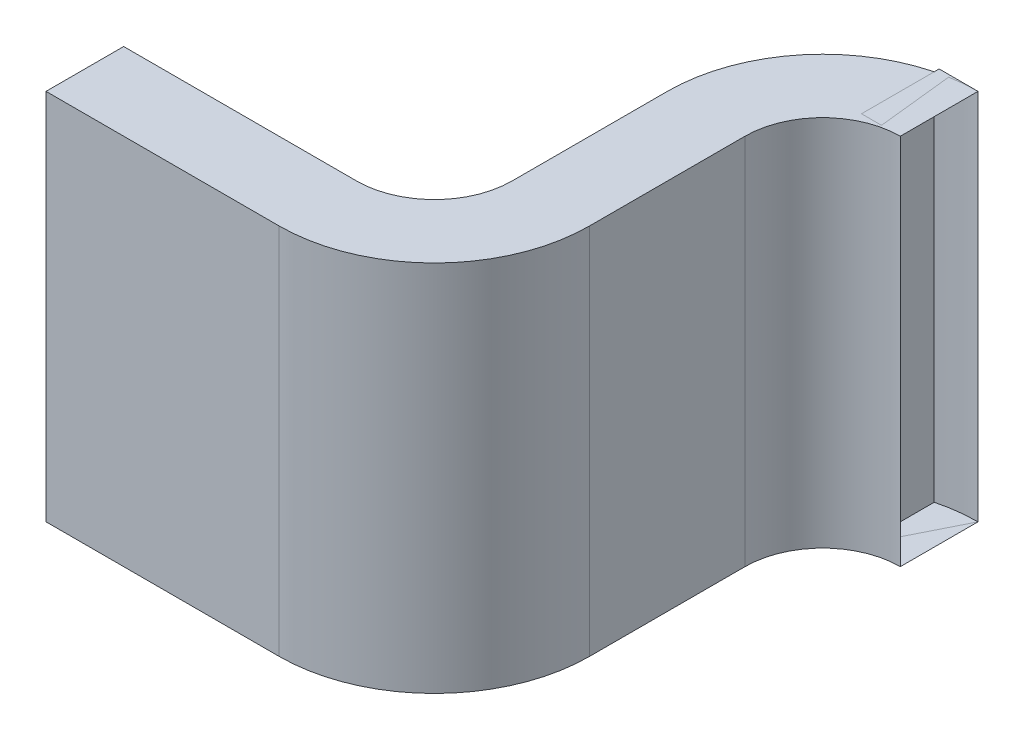
ISO-10303-21;
HEADER;
FILE_DESCRIPTION(('STEP AP214'),'2;1');
FILE_NAME('part.step','',(''),(''),'','','');
FILE_SCHEMA(('AUTOMOTIVE_DESIGN { 1 0 10303 214 1 1 1 1 }'));
ENDSEC;
DATA;
#1=APPLICATION_CONTEXT('core data for automotive mechanical design processes');
#2=APPLICATION_PROTOCOL_DEFINITION('international standard','automotive_design',2000,#1);
#3=PRODUCT_CONTEXT('',#1,'mechanical');
#4=PRODUCT('Part','Part','',(#3));
#5=PRODUCT_RELATED_PRODUCT_CATEGORY('part','',(#4));
#6=PRODUCT_DEFINITION_FORMATION('','',#4);
#7=PRODUCT_DEFINITION_CONTEXT('part definition',#1,'design');
#8=PRODUCT_DEFINITION('design','',#6,#7);
#9=PRODUCT_DEFINITION_SHAPE('','',#8);
#10=(LENGTH_UNIT() NAMED_UNIT(*) SI_UNIT(.MILLI.,.METRE.));
#11=(NAMED_UNIT(*) PLANE_ANGLE_UNIT() SI_UNIT($,.RADIAN.));
#12=(NAMED_UNIT(*) SI_UNIT($,.STERADIAN.) SOLID_ANGLE_UNIT());
#13=UNCERTAINTY_MEASURE_WITH_UNIT(LENGTH_MEASURE(1.E-05),#10,'distance_accuracy_value','');
#14=(GEOMETRIC_REPRESENTATION_CONTEXT(3) GLOBAL_UNCERTAINTY_ASSIGNED_CONTEXT((#13)) GLOBAL_UNIT_ASSIGNED_CONTEXT((#10,
#11,#12)) REPRESENTATION_CONTEXT('',''));
#15=CARTESIAN_POINT('',(0.,0.,0.));
#16=DIRECTION('',(0.,0.,1.));
#17=DIRECTION('',(1.,0.,0.));
#18=AXIS2_PLACEMENT_3D('',#15,#16,#17);
#19=CARTESIAN_POINT('',(0.,0.24,0.6));
#20=DIRECTION('',(0.,0.,-1.));
#21=DIRECTION('',(-1.,0.,0.));
#22=AXIS2_PLACEMENT_3D('',#19,#20,#21);
#23=PLANE('',#22);
#24=DIRECTION('',(1.,0.,0.));
#25=VECTOR('',#24,1.);
#26=CARTESIAN_POINT('',(0.,0.24,0.6));
#27=LINE('',#26,#25);
#28=CARTESIAN_POINT('',(0.3,0.24,0.6));
#29=VERTEX_POINT('',#28);
#30=CARTESIAN_POINT('',(0.,0.24,0.6));
#31=VERTEX_POINT('',#30);
#32=EDGE_CURVE('E191',#29,#31,#27,.F.);
#33=ORIENTED_EDGE('',*,*,#32,.T.);
#34=DIRECTION('',(0.,1.,0.));
#35=VECTOR('',#34,1.);
#36=CARTESIAN_POINT('',(0.,-0.24,0.6));
#37=LINE('',#36,#35);
#38=CARTESIAN_POINT('',(0.,-0.24,0.6));
#39=VERTEX_POINT('',#38);
#40=EDGE_CURVE('E93',#39,#31,#37,.T.);
#41=ORIENTED_EDGE('',*,*,#40,.F.);
#42=DIRECTION('',(1.,0.,0.));
#43=VECTOR('',#42,1.);
#44=CARTESIAN_POINT('',(0.,-0.24,0.6));
#45=LINE('',#44,#43);
#46=CARTESIAN_POINT('',(0.3,-0.24,0.6));
#47=VERTEX_POINT('',#46);
#48=EDGE_CURVE('E174',#39,#47,#45,.T.);
#49=ORIENTED_EDGE('',*,*,#48,.T.);
#50=DIRECTION('',(0.,1.,0.));
#51=VECTOR('',#50,1.);
#52=CARTESIAN_POINT('',(0.3,0.24,0.6));
#53=LINE('',#52,#51);
#54=EDGE_CURVE('E85',#29,#47,#53,.F.);
#55=ORIENTED_EDGE('',*,*,#54,.F.);
#56=EDGE_LOOP('',(#33,#41,#49,#55));
#57=FACE_BOUND('',#56,.T.);
#58=ADVANCED_FACE('F16',(#57),#23,.F.);
#59=CARTESIAN_POINT('',(0.,-0.24,0.5));
#60=DIRECTION('',(-1.,0.,0.));
#61=DIRECTION('',(0.,0.,1.));
#62=AXIS2_PLACEMENT_3D('',#59,#60,#61);
#63=PLANE('',#62);
#64=DIRECTION('',(0.,0.,1.));
#65=VECTOR('',#64,1.);
#66=CARTESIAN_POINT('',(0.,0.24,0.5));
#67=LINE('',#66,#65);
#68=CARTESIAN_POINT('',(0.,0.24,0.5));
#69=VERTEX_POINT('',#68);
#70=EDGE_CURVE('E181',#31,#69,#67,.F.);
#71=ORIENTED_EDGE('',*,*,#70,.T.);
#72=DIRECTION('',(0.,1.,0.));
#73=VECTOR('',#72,1.);
#74=CARTESIAN_POINT('',(0.,-0.24,0.5));
#75=LINE('',#74,#73);
#76=CARTESIAN_POINT('',(0.,-0.24,0.5));
#77=VERTEX_POINT('',#76);
#78=EDGE_CURVE('E164',#69,#77,#75,.F.);
#79=ORIENTED_EDGE('',*,*,#78,.T.);
#80=DIRECTION('',(0.,0.,1.));
#81=VECTOR('',#80,1.);
#82=CARTESIAN_POINT('',(0.,-0.24,0.6));
#83=LINE('',#82,#81);
#84=EDGE_CURVE('E176',#77,#39,#83,.T.);
#85=ORIENTED_EDGE('',*,*,#84,.T.);
#86=ORIENTED_EDGE('',*,*,#40,.T.);
#87=EDGE_LOOP('',(#71,#79,#85,#86));
#88=FACE_BOUND('',#87,.T.);
#89=ADVANCED_FACE('F232',(#88),#63,.T.);
#90=CARTESIAN_POINT('',(0.3,0.24,0.4));
#91=DIRECTION('',(0.,1.,0.));
#92=DIRECTION('',(0.,0.,1.));
#93=AXIS2_PLACEMENT_3D('',#90,#91,#92);
#94=CYLINDRICAL_SURFACE('',#93,0.2);
#95=CARTESIAN_POINT('',(0.3,0.24,0.4));
#96=DIRECTION('',(0.,1.,0.));
#97=DIRECTION('',(0.,0.,1.));
#98=AXIS2_PLACEMENT_3D('',#95,#96,#97);
#99=CIRCLE('',#98,0.2);
#100=CARTESIAN_POINT('',(0.5,0.24,0.4));
#101=VERTEX_POINT('',#100);
#102=EDGE_CURVE('E19',#29,#101,#99,.T.);
#103=ORIENTED_EDGE('',*,*,#102,.F.);
#104=ORIENTED_EDGE('',*,*,#54,.T.);
#105=CARTESIAN_POINT('',(0.3,-0.24,0.4));
#106=DIRECTION('',(0.,1.,0.));
#107=DIRECTION('',(0.,0.,1.));
#108=AXIS2_PLACEMENT_3D('',#105,#106,#107);
#109=CIRCLE('',#108,0.2);
#110=CARTESIAN_POINT('',(0.5,-0.24,0.4));
#111=VERTEX_POINT('',#110);
#112=EDGE_CURVE('E157',#111,#47,#109,.F.);
#113=ORIENTED_EDGE('',*,*,#112,.F.);
#114=DIRECTION('',(0.,1.,0.));
#115=VECTOR('',#114,1.);
#116=CARTESIAN_POINT('',(0.5,0.24,0.4));
#117=LINE('',#116,#115);
#118=EDGE_CURVE('E152',#111,#101,#117,.T.);
#119=ORIENTED_EDGE('',*,*,#118,.T.);
#120=EDGE_LOOP('',(#103,#104,#113,#119));
#121=FACE_BOUND('',#120,.T.);
#122=ADVANCED_FACE('F220',(#121),#94,.T.);
#123=CARTESIAN_POINT('',(0.6,0.24,0.1));
#124=DIRECTION('',(0.,0.,1.));
#125=DIRECTION('',(1.,0.,0.));
#126=AXIS2_PLACEMENT_3D('',#123,#124,#125);
#127=PLANE('',#126);
#128=DIRECTION('',(1.,0.,0.));
#129=VECTOR('',#128,1.);
#130=CARTESIAN_POINT('',(0.6,0.24,0.1));
#131=LINE('',#130,#129);
#132=CARTESIAN_POINT('',(0.55,0.24,0.1));
#133=VERTEX_POINT('',#132);
#134=CARTESIAN_POINT('',(0.6,0.24,0.1));
#135=VERTEX_POINT('',#134);
#136=EDGE_CURVE('E150',#133,#135,#131,.T.);
#137=ORIENTED_EDGE('',*,*,#136,.T.);
#138=DIRECTION('',(0.,-1.,0.));
#139=VECTOR('',#138,1.);
#140=CARTESIAN_POINT('',(0.6,0.24,0.1));
#141=LINE('',#140,#139);
#142=CARTESIAN_POINT('',(0.6,-0.24,0.1));
#143=VERTEX_POINT('',#142);
#144=EDGE_CURVE('E149',#135,#143,#141,.T.);
#145=ORIENTED_EDGE('',*,*,#144,.T.);
#146=DIRECTION('',(1.,0.,0.));
#147=VECTOR('',#146,1.);
#148=CARTESIAN_POINT('',(0.6,-0.24,0.1));
#149=LINE('',#148,#147);
#150=CARTESIAN_POINT('',(0.55,-0.24,0.1));
#151=VERTEX_POINT('',#150);
#152=EDGE_CURVE('E121',#143,#151,#149,.F.);
#153=ORIENTED_EDGE('',*,*,#152,.T.);
#154=DIRECTION('',(0.,1.,0.));
#155=VECTOR('',#154,1.);
#156=CARTESIAN_POINT('',(0.55,-0.24,0.1));
#157=LINE('',#156,#155);
#158=EDGE_CURVE('E117',#151,#133,#157,.T.);
#159=ORIENTED_EDGE('',*,*,#158,.T.);
#160=EDGE_LOOP('',(#137,#145,#153,#159));
#161=FACE_BOUND('',#160,.T.);
#162=ADVANCED_FACE('F276',(#161),#127,.F.);
#163=CARTESIAN_POINT('',(0.,-0.24,0.5));
#164=DIRECTION('',(0.,0.,1.));
#165=DIRECTION('',(1.,0.,0.));
#166=AXIS2_PLACEMENT_3D('',#163,#164,#165);
#167=PLANE('',#166);
#168=DIRECTION('',(1.,0.,0.));
#169=VECTOR('',#168,1.);
#170=CARTESIAN_POINT('',(0.,-0.24,0.5));
#171=LINE('',#170,#169);
#172=CARTESIAN_POINT('',(0.3,-0.24,0.5));
#173=VERTEX_POINT('',#172);
#174=EDGE_CURVE('E162',#77,#173,#171,.T.);
#175=ORIENTED_EDGE('',*,*,#174,.F.);
#176=ORIENTED_EDGE('',*,*,#78,.F.);
#177=DIRECTION('',(1.,0.,0.));
#178=VECTOR('',#177,1.);
#179=CARTESIAN_POINT('',(0.,0.24,0.5));
#180=LINE('',#179,#178);
#181=CARTESIAN_POINT('',(0.3,0.24,0.5));
#182=VERTEX_POINT('',#181);
#183=EDGE_CURVE('E167',#182,#69,#180,.F.);
#184=ORIENTED_EDGE('',*,*,#183,.F.);
#185=DIRECTION('',(0.,1.,0.));
#186=VECTOR('',#185,1.);
#187=CARTESIAN_POINT('',(0.3,-0.24,0.5));
#188=LINE('',#187,#186);
#189=EDGE_CURVE('E158',#182,#173,#188,.F.);
#190=ORIENTED_EDGE('',*,*,#189,.T.);
#191=EDGE_LOOP('',(#175,#176,#184,#190));
#192=FACE_BOUND('',#191,.T.);
#193=ADVANCED_FACE('F273',(#192),#167,.F.);
#194=CARTESIAN_POINT('',(0.5,0.24,0.4));
#195=DIRECTION('',(-1.,0.,0.));
#196=DIRECTION('',(0.,0.,1.));
#197=AXIS2_PLACEMENT_3D('',#194,#195,#196);
#198=PLANE('',#197);
#199=DIRECTION('',(0.,0.,-1.));
#200=VECTOR('',#199,1.);
#201=CARTESIAN_POINT('',(0.5,0.24,0.4));
#202=LINE('',#201,#200);
#203=CARTESIAN_POINT('',(0.5,0.24,0.2));
#204=VERTEX_POINT('',#203);
#205=EDGE_CURVE('E145',#204,#101,#202,.F.);
#206=ORIENTED_EDGE('',*,*,#205,.T.);
#207=ORIENTED_EDGE('',*,*,#118,.F.);
#208=DIRECTION('',(0.,0.,1.));
#209=VECTOR('',#208,1.);
#210=CARTESIAN_POINT('',(0.5,-0.24,0.4));
#211=LINE('',#210,#209);
#212=CARTESIAN_POINT('',(0.5,-0.24,0.2));
#213=VERTEX_POINT('',#212);
#214=EDGE_CURVE('E211',#111,#213,#211,.F.);
#215=ORIENTED_EDGE('',*,*,#214,.T.);
#216=DIRECTION('',(0.,-1.,0.));
#217=VECTOR('',#216,1.);
#218=CARTESIAN_POINT('',(0.5,0.24,0.2));
#219=LINE('',#218,#217);
#220=EDGE_CURVE('E120',#213,#204,#219,.F.);
#221=ORIENTED_EDGE('',*,*,#220,.T.);
#222=EDGE_LOOP('',(#206,#207,#215,#221));
#223=FACE_BOUND('',#222,.T.);
#224=ADVANCED_FACE('F222',(#223),#198,.F.);
#225=CARTESIAN_POINT('',(0.6,0.24,0.));
#226=DIRECTION('',(0.,1.,0.));
#227=DIRECTION('',(0.,0.,1.));
#228=AXIS2_PLACEMENT_3D('',#225,#226,#227);
#229=PLANE('',#228);
#230=DIRECTION('',(-1.,0.,0.));
#231=VECTOR('',#230,1.);
#232=CARTESIAN_POINT('',(0.6,0.24,0.));
#233=LINE('',#232,#231);
#234=CARTESIAN_POINT('',(0.55,0.24,0.));
#235=VERTEX_POINT('',#234);
#236=CARTESIAN_POINT('',(0.6,0.24,0.));
#237=VERTEX_POINT('',#236);
#238=EDGE_CURVE('E130',#235,#237,#233,.F.);
#239=ORIENTED_EDGE('',*,*,#238,.T.);
#240=DIRECTION('',(0.,0.,1.));
#241=VECTOR('',#240,1.);
#242=CARTESIAN_POINT('',(0.6,0.24,0.09393398282202));
#243=LINE('',#242,#241);
#244=EDGE_CURVE('E210',#135,#237,#243,.F.);
#245=ORIENTED_EDGE('',*,*,#244,.F.);
#246=ORIENTED_EDGE('',*,*,#136,.F.);
#247=DIRECTION('',(0.,0.,1.));
#248=VECTOR('',#247,1.);
#249=CARTESIAN_POINT('',(0.55,0.24,0.));
#250=LINE('',#249,#248);
#251=EDGE_CURVE('E141',#133,#235,#250,.F.);
#252=ORIENTED_EDGE('',*,*,#251,.T.);
#253=EDGE_LOOP('',(#239,#245,#246,#252));
#254=FACE_BOUND('',#253,.T.);
#255=ADVANCED_FACE('F267',(#254),#229,.F.);
#256=CARTESIAN_POINT('',(0.55,-0.24,0.));
#257=DIRECTION('',(-1.,0.,0.));
#258=DIRECTION('',(0.,0.,1.));
#259=AXIS2_PLACEMENT_3D('',#256,#257,#258);
#260=PLANE('',#259);
#261=ORIENTED_EDGE('',*,*,#251,.F.);
#262=ORIENTED_EDGE('',*,*,#158,.F.);
#263=DIRECTION('',(0.,0.,-1.));
#264=VECTOR('',#263,1.);
#265=CARTESIAN_POINT('',(0.55,-0.24,0.1));
#266=LINE('',#265,#264);
#267=CARTESIAN_POINT('',(0.55,-0.24,0.));
#268=VERTEX_POINT('',#267);
#269=EDGE_CURVE('E110',#151,#268,#266,.T.);
#270=ORIENTED_EDGE('',*,*,#269,.T.);
#271=DIRECTION('',(0.,1.,0.));
#272=VECTOR('',#271,1.);
#273=CARTESIAN_POINT('',(0.55,-0.24,0.));
#274=LINE('',#273,#272);
#275=EDGE_CURVE('E115',#268,#235,#274,.T.);
#276=ORIENTED_EDGE('',*,*,#275,.T.);
#277=EDGE_LOOP('',(#261,#262,#270,#276));
#278=FACE_BOUND('',#277,.T.);
#279=ADVANCED_FACE('F113',(#278),#260,.F.);
#280=CARTESIAN_POINT('',(0.6,-0.24,0.1));
#281=DIRECTION('',(0.,-1.,0.));
#282=DIRECTION('',(0.,0.,-1.));
#283=AXIS2_PLACEMENT_3D('',#280,#281,#282);
#284=PLANE('',#283);
#285=ORIENTED_EDGE('',*,*,#152,.F.);
#286=DIRECTION('',(0.,0.,-1.));
#287=VECTOR('',#286,1.);
#288=CARTESIAN_POINT('',(0.6,-0.24,0.09393398282202));
#289=LINE('',#288,#287);
#290=CARTESIAN_POINT('',(0.6,-0.24,0.));
#291=VERTEX_POINT('',#290);
#292=EDGE_CURVE('E127',#291,#143,#289,.F.);
#293=ORIENTED_EDGE('',*,*,#292,.F.);
#294=DIRECTION('',(-1.,0.,0.));
#295=VECTOR('',#294,1.);
#296=CARTESIAN_POINT('',(0.6,-0.24,0.));
#297=LINE('',#296,#295);
#298=EDGE_CURVE('E124',#291,#268,#297,.T.);
#299=ORIENTED_EDGE('',*,*,#298,.T.);
#300=ORIENTED_EDGE('',*,*,#269,.F.);
#301=EDGE_LOOP('',(#285,#293,#299,#300));
#302=FACE_BOUND('',#301,.T.);
#303=ADVANCED_FACE('F125',(#302),#284,.F.);
#304=CARTESIAN_POINT('',(0.6,0.24,0.2));
#305=DIRECTION('',(0.,-1.,0.));
#306=DIRECTION('',(0.,0.,-1.));
#307=AXIS2_PLACEMENT_3D('',#304,#305,#306);
#308=CYLINDRICAL_SURFACE('',#307,0.1);
#309=CARTESIAN_POINT('',(0.6,0.24,0.2));
#310=DIRECTION('',(0.,-1.,0.));
#311=DIRECTION('',(0.,0.,-1.));
#312=AXIS2_PLACEMENT_3D('',#309,#310,#311);
#313=CIRCLE('',#312,0.1);
#314=EDGE_CURVE('E207',#204,#135,#313,.T.);
#315=ORIENTED_EDGE('',*,*,#314,.F.);
#316=ORIENTED_EDGE('',*,*,#220,.F.);
#317=CARTESIAN_POINT('',(0.6,-0.24,0.2));
#318=DIRECTION('',(0.,-1.,0.));
#319=DIRECTION('',(0.,0.,-1.));
#320=AXIS2_PLACEMENT_3D('',#317,#318,#319);
#321=CIRCLE('',#320,0.1);
#322=EDGE_CURVE('E134',#143,#213,#321,.F.);
#323=ORIENTED_EDGE('',*,*,#322,.F.);
#324=ORIENTED_EDGE('',*,*,#144,.F.);
#325=EDGE_LOOP('',(#315,#316,#323,#324));
#326=FACE_BOUND('',#325,.T.);
#327=ADVANCED_FACE('F258',(#326),#308,.F.);
#328=CARTESIAN_POINT('',(0.3,-0.24,0.4));
#329=DIRECTION('',(0.,1.,0.));
#330=DIRECTION('',(0.,0.,1.));
#331=AXIS2_PLACEMENT_3D('',#328,#329,#330);
#332=CYLINDRICAL_SURFACE('',#331,0.1);
#333=CARTESIAN_POINT('',(0.3,-0.24,0.4));
#334=DIRECTION('',(0.,1.,0.));
#335=DIRECTION('',(0.,0.,1.));
#336=AXIS2_PLACEMENT_3D('',#333,#334,#335);
#337=CIRCLE('',#336,0.1);
#338=CARTESIAN_POINT('',(0.4,-0.24,0.4));
#339=VERTEX_POINT('',#338);
#340=EDGE_CURVE('E161',#173,#339,#337,.T.);
#341=ORIENTED_EDGE('',*,*,#340,.F.);
#342=ORIENTED_EDGE('',*,*,#189,.F.);
#343=CARTESIAN_POINT('',(0.3,0.24,0.4));
#344=DIRECTION('',(0.,1.,0.));
#345=DIRECTION('',(0.,0.,1.));
#346=AXIS2_PLACEMENT_3D('',#343,#344,#345);
#347=CIRCLE('',#346,0.1);
#348=CARTESIAN_POINT('',(0.4,0.24,0.4));
#349=VERTEX_POINT('',#348);
#350=EDGE_CURVE('E148',#349,#182,#347,.F.);
#351=ORIENTED_EDGE('',*,*,#350,.F.);
#352=DIRECTION('',(0.,1.,0.));
#353=VECTOR('',#352,1.);
#354=CARTESIAN_POINT('',(0.4,-0.24,0.4));
#355=LINE('',#354,#353);
#356=EDGE_CURVE('E393',#349,#339,#355,.F.);
#357=ORIENTED_EDGE('',*,*,#356,.T.);
#358=EDGE_LOOP('',(#341,#342,#351,#357));
#359=FACE_BOUND('',#358,.T.);
#360=ADVANCED_FACE('F255',(#359),#332,.F.);
#361=CARTESIAN_POINT('',(0.493933982822,0.24,0.09393398282202));
#362=DIRECTION('',(0.,1.,0.));
#363=DIRECTION('',(0.,0.,1.));
#364=AXIS2_PLACEMENT_3D('',#361,#362,#363);
#365=PLANE('',#364);
#366=CARTESIAN_POINT('',(0.6,0.24,0.2));
#367=DIRECTION('',(0.,-1.,0.));
#368=DIRECTION('',(0.,0.,-1.));
#369=AXIS2_PLACEMENT_3D('',#366,#367,#368);
#370=CIRCLE('',#369,0.2);
#371=CARTESIAN_POINT('',(0.4,0.24,0.2));
#372=VERTEX_POINT('',#371);
#373=EDGE_CURVE('E201',#372,#237,#370,.T.);
#374=ORIENTED_EDGE('',*,*,#373,.F.);
#375=DIRECTION('',(0.,0.,-1.));
#376=VECTOR('',#375,1.);
#377=CARTESIAN_POINT('',(0.4,0.24,0.4));
#378=LINE('',#377,#376);
#379=EDGE_CURVE('E206',#372,#349,#378,.F.);
#380=ORIENTED_EDGE('',*,*,#379,.T.);
#381=ORIENTED_EDGE('',*,*,#350,.T.);
#382=ORIENTED_EDGE('',*,*,#183,.T.);
#383=ORIENTED_EDGE('',*,*,#70,.F.);
#384=ORIENTED_EDGE('',*,*,#32,.F.);
#385=ORIENTED_EDGE('',*,*,#102,.T.);
#386=ORIENTED_EDGE('',*,*,#205,.F.);
#387=ORIENTED_EDGE('',*,*,#314,.T.);
#388=ORIENTED_EDGE('',*,*,#244,.T.);
#389=EDGE_LOOP('',(#374,#380,#381,#382,#383,#384,#385,#386,#387,#388));
#390=FACE_BOUND('',#389,.T.);
#391=ADVANCED_FACE('F229',(#390),#365,.T.);
#392=CARTESIAN_POINT('',(0.6,-0.24,0.));
#393=DIRECTION('',(0.,0.,-1.));
#394=DIRECTION('',(-1.,0.,0.));
#395=AXIS2_PLACEMENT_3D('',#392,#393,#394);
#396=PLANE('',#395);
#397=ORIENTED_EDGE('',*,*,#298,.F.);
#398=DIRECTION('',(0.,-1.,0.));
#399=VECTOR('',#398,1.);
#400=CARTESIAN_POINT('',(0.6,-0.24,0.));
#401=LINE('',#400,#399);
#402=EDGE_CURVE('E200',#237,#291,#401,.T.);
#403=ORIENTED_EDGE('',*,*,#402,.F.);
#404=ORIENTED_EDGE('',*,*,#238,.F.);
#405=ORIENTED_EDGE('',*,*,#275,.F.);
#406=EDGE_LOOP('',(#397,#403,#404,#405));
#407=FACE_BOUND('',#406,.T.);
#408=ADVANCED_FACE('F132',(#407),#396,.F.);
#409=CARTESIAN_POINT('',(0.493933982822,-0.24,0.09393398282202));
#410=DIRECTION('',(0.,-1.,0.));
#411=DIRECTION('',(0.,0.,-1.));
#412=AXIS2_PLACEMENT_3D('',#409,#410,#411);
#413=PLANE('',#412);
#414=ORIENTED_EDGE('',*,*,#322,.T.);
#415=ORIENTED_EDGE('',*,*,#214,.F.);
#416=ORIENTED_EDGE('',*,*,#112,.T.);
#417=ORIENTED_EDGE('',*,*,#48,.F.);
#418=ORIENTED_EDGE('',*,*,#84,.F.);
#419=ORIENTED_EDGE('',*,*,#174,.T.);
#420=ORIENTED_EDGE('',*,*,#340,.T.);
#421=DIRECTION('',(0.,0.,-1.));
#422=VECTOR('',#421,1.);
#423=CARTESIAN_POINT('',(0.4,-0.24,0.4));
#424=LINE('',#423,#422);
#425=CARTESIAN_POINT('',(0.4,-0.24,0.2));
#426=VERTEX_POINT('',#425);
#427=EDGE_CURVE('E34',#339,#426,#424,.T.);
#428=ORIENTED_EDGE('',*,*,#427,.T.);
#429=CARTESIAN_POINT('',(0.6,-0.24,0.2));
#430=DIRECTION('',(0.,-1.,0.));
#431=DIRECTION('',(0.,0.,-1.));
#432=AXIS2_PLACEMENT_3D('',#429,#430,#431);
#433=CIRCLE('',#432,0.2);
#434=EDGE_CURVE('E25',#291,#426,#433,.F.);
#435=ORIENTED_EDGE('',*,*,#434,.F.);
#436=ORIENTED_EDGE('',*,*,#292,.T.);
#437=EDGE_LOOP('',(#414,#415,#416,#417,#418,#419,#420,#428,#435,#436));
#438=FACE_BOUND('',#437,.T.);
#439=ADVANCED_FACE('F216',(#438),#413,.T.);
#440=CARTESIAN_POINT('',(0.4,-0.24,0.4));
#441=DIRECTION('',(1.,0.,0.));
#442=DIRECTION('',(0.,0.,-1.));
#443=AXIS2_PLACEMENT_3D('',#440,#441,#442);
#444=PLANE('',#443);
#445=ORIENTED_EDGE('',*,*,#427,.F.);
#446=ORIENTED_EDGE('',*,*,#356,.F.);
#447=ORIENTED_EDGE('',*,*,#379,.F.);
#448=DIRECTION('',(0.,-1.,0.));
#449=VECTOR('',#448,1.);
#450=CARTESIAN_POINT('',(0.4,-0.24,0.2));
#451=LINE('',#450,#449);
#452=EDGE_CURVE('E10',#426,#372,#451,.F.);
#453=ORIENTED_EDGE('',*,*,#452,.F.);
#454=EDGE_LOOP('',(#445,#446,#447,#453));
#455=FACE_BOUND('',#454,.T.);
#456=ADVANCED_FACE('F240',(#455),#444,.F.);
#457=CARTESIAN_POINT('',(0.6,-0.24,0.2));
#458=DIRECTION('',(0.,-1.,0.));
#459=DIRECTION('',(0.,0.,-1.));
#460=AXIS2_PLACEMENT_3D('',#457,#458,#459);
#461=CYLINDRICAL_SURFACE('',#460,0.2);
#462=ORIENTED_EDGE('',*,*,#434,.T.);
#463=ORIENTED_EDGE('',*,*,#452,.T.);
#464=ORIENTED_EDGE('',*,*,#373,.T.);
#465=ORIENTED_EDGE('',*,*,#402,.T.);
#466=EDGE_LOOP('',(#462,#463,#464,#465));
#467=FACE_BOUND('',#466,.T.);
#468=ADVANCED_FACE('F238',(#467),#461,.T.);
#469=CLOSED_SHELL('',(#58,#89,#122,#162,#193,#224,#255,#279,#303,#327,#360,#391,#408,#439,#456,#468));
#470=MANIFOLD_SOLID_BREP('B1',#469);
#471=ADVANCED_BREP_SHAPE_REPRESENTATION('',(#18,#470),#14);
#472=SHAPE_DEFINITION_REPRESENTATION(#9,#471);
ENDSEC;
END-ISO-10303-21;
